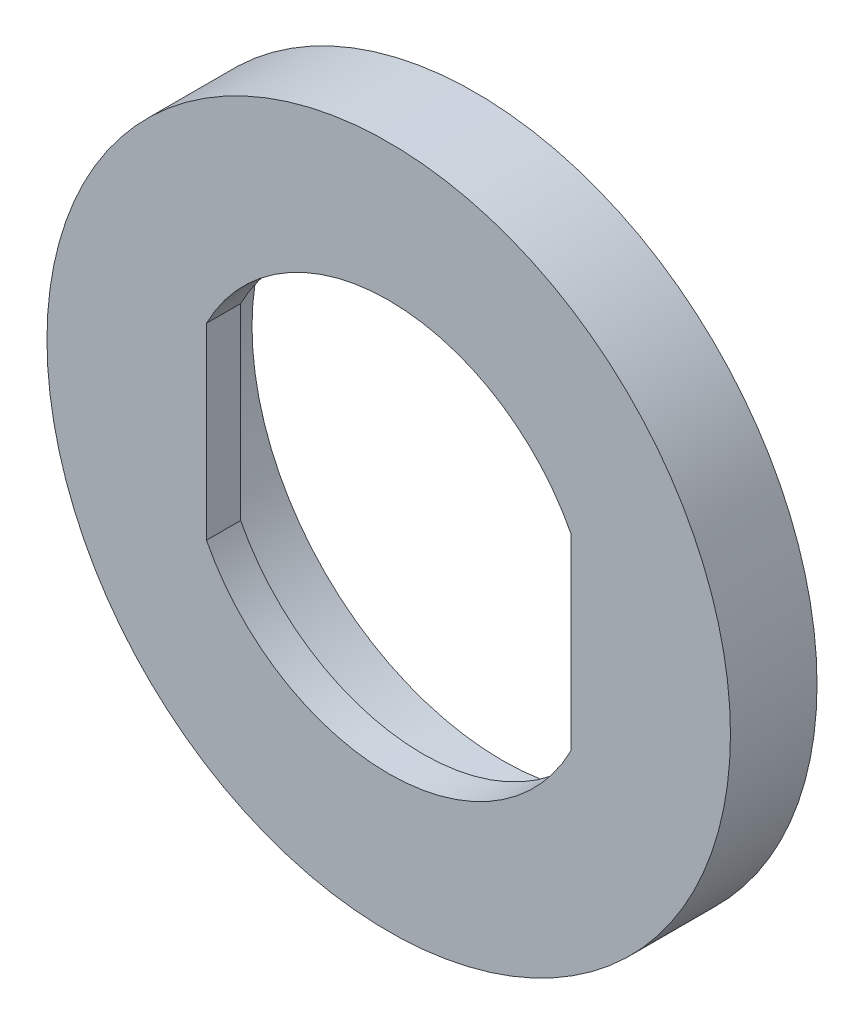
ISO-10303-21;
HEADER;
FILE_DESCRIPTION(('STEP AP214'),'2;1');
FILE_NAME('part.step','',(''),(''),'','','');
FILE_SCHEMA(('AUTOMOTIVE_DESIGN { 1 0 10303 214 1 1 1 1 }'));
ENDSEC;
DATA;
#1=APPLICATION_CONTEXT('core data for automotive mechanical design processes');
#2=APPLICATION_PROTOCOL_DEFINITION('international standard','automotive_design',2000,#1);
#3=PRODUCT_CONTEXT('',#1,'mechanical');
#4=PRODUCT('Part','Part','',(#3));
#5=PRODUCT_RELATED_PRODUCT_CATEGORY('part','',(#4));
#6=PRODUCT_DEFINITION_FORMATION('','',#4);
#7=PRODUCT_DEFINITION_CONTEXT('part definition',#1,'design');
#8=PRODUCT_DEFINITION('design','',#6,#7);
#9=PRODUCT_DEFINITION_SHAPE('','',#8);
#10=(LENGTH_UNIT() NAMED_UNIT(*) SI_UNIT(.MILLI.,.METRE.));
#11=(NAMED_UNIT(*) PLANE_ANGLE_UNIT() SI_UNIT($,.RADIAN.));
#12=(NAMED_UNIT(*) SI_UNIT($,.STERADIAN.) SOLID_ANGLE_UNIT());
#13=UNCERTAINTY_MEASURE_WITH_UNIT(LENGTH_MEASURE(1.E-05),#10,'distance_accuracy_value','');
#14=(GEOMETRIC_REPRESENTATION_CONTEXT(3) GLOBAL_UNCERTAINTY_ASSIGNED_CONTEXT((#13)) GLOBAL_UNIT_ASSIGNED_CONTEXT((#10,
#11,#12)) REPRESENTATION_CONTEXT('',''));
#15=CARTESIAN_POINT('',(0.,0.,0.));
#16=DIRECTION('',(0.,0.,1.));
#17=DIRECTION('',(1.,0.,0.));
#18=AXIS2_PLACEMENT_3D('',#15,#16,#17);
#19=CARTESIAN_POINT('',(0.,0.,1.20000000000001));
#20=DIRECTION('',(0.,0.,1.));
#21=DIRECTION('',(1.,0.,0.));
#22=AXIS2_PLACEMENT_3D('',#19,#20,#21);
#23=PLANE('',#22);
#24=CARTESIAN_POINT('',(0.,0.,1.20000000000001));
#25=DIRECTION('',(0.,0.,1.));
#26=DIRECTION('',(1.,0.,0.));
#27=AXIS2_PLACEMENT_3D('',#24,#25,#26);
#28=CIRCLE('',#27,15.);
#29=CARTESIAN_POINT('',(15.,0.,1.20000000000001));
#30=VERTEX_POINT('',#29);
#31=EDGE_CURVE('E115',#30,#30,#28,.T.);
#32=ORIENTED_EDGE('',*,*,#31,.F.);
#33=EDGE_LOOP('',(#32));
#34=FACE_BOUND('',#33,.T.);
#35=CARTESIAN_POINT('',(0.,0.,1.20000000000001));
#36=DIRECTION('',(0.,0.,1.));
#37=DIRECTION('',(1.,0.,0.));
#38=AXIS2_PLACEMENT_3D('',#35,#36,#37);
#39=CIRCLE('',#38,13.);
#40=CARTESIAN_POINT('',(13.,0.,1.20000000000001));
#41=VERTEX_POINT('',#40);
#42=EDGE_CURVE('E11',#41,#41,#39,.T.);
#43=ORIENTED_EDGE('',*,*,#42,.T.);
#44=EDGE_LOOP('',(#43));
#45=FACE_BOUND('',#44,.T.);
#46=ADVANCED_FACE('F32',(#34,#45),#23,.F.);
#47=CARTESIAN_POINT('',(0.,0.,1.20000000000001));
#48=DIRECTION('',(0.,0.,1.));
#49=DIRECTION('',(1.,0.,0.));
#50=AXIS2_PLACEMENT_3D('',#47,#48,#49);
#51=CYLINDRICAL_SURFACE('',#50,15.);
#52=ORIENTED_EDGE('',*,*,#31,.T.);
#53=EDGE_LOOP('',(#52));
#54=FACE_BOUND('',#53,.T.);
#55=CARTESIAN_POINT('',(0.,0.,5.));
#56=DIRECTION('',(0.,0.,1.));
#57=DIRECTION('',(1.,0.,0.));
#58=AXIS2_PLACEMENT_3D('',#55,#56,#57);
#59=CIRCLE('',#58,15.);
#60=CARTESIAN_POINT('',(15.,0.,5.));
#61=VERTEX_POINT('',#60);
#62=EDGE_CURVE('E112',#61,#61,#59,.T.);
#63=ORIENTED_EDGE('',*,*,#62,.F.);
#64=EDGE_LOOP('',(#63));
#65=FACE_BOUND('',#64,.T.);
#66=ADVANCED_FACE('F138',(#54,#65),#51,.T.);
#67=CARTESIAN_POINT('',(0.,0.,5.));
#68=DIRECTION('',(0.,0.,1.));
#69=DIRECTION('',(1.,0.,0.));
#70=AXIS2_PLACEMENT_3D('',#67,#68,#69);
#71=PLANE('',#70);
#72=CARTESIAN_POINT('',(0.,0.,5.));
#73=DIRECTION('',(0.,0.,1.));
#74=DIRECTION('',(1.,0.,0.));
#75=AXIS2_PLACEMENT_3D('',#72,#73,#74);
#76=CIRCLE('',#75,9.);
#77=CARTESIAN_POINT('',(8.,4.12310562561767,5.));
#78=VERTEX_POINT('',#77);
#79=CARTESIAN_POINT('',(-8.00000000000002,4.12310562561766,5.));
#80=VERTEX_POINT('',#79);
#81=EDGE_CURVE('E107',#78,#80,#76,.T.);
#82=ORIENTED_EDGE('',*,*,#81,.F.);
#83=DIRECTION('',(0.,1.,0.));
#84=VECTOR('',#83,1.);
#85=CARTESIAN_POINT('',(8.00000000000002,0.,5.));
#86=LINE('',#85,#84);
#87=CARTESIAN_POINT('',(8.00000000000002,-4.12310562561766,5.));
#88=VERTEX_POINT('',#87);
#89=EDGE_CURVE('E100',#88,#78,#86,.T.);
#90=ORIENTED_EDGE('',*,*,#89,.F.);
#91=CARTESIAN_POINT('',(0.,0.,5.));
#92=DIRECTION('',(0.,0.,1.));
#93=DIRECTION('',(1.,0.,0.));
#94=AXIS2_PLACEMENT_3D('',#91,#92,#93);
#95=CIRCLE('',#94,9.);
#96=CARTESIAN_POINT('',(-8.00000000000001,-4.12310562561766,5.));
#97=VERTEX_POINT('',#96);
#98=EDGE_CURVE('E80',#97,#88,#95,.T.);
#99=ORIENTED_EDGE('',*,*,#98,.F.);
#100=DIRECTION('',(0.,-1.,0.));
#101=VECTOR('',#100,1.);
#102=CARTESIAN_POINT('',(-8.00000000000001,0.,5.));
#103=LINE('',#102,#101);
#104=EDGE_CURVE('E105',#80,#97,#103,.T.);
#105=ORIENTED_EDGE('',*,*,#104,.F.);
#106=EDGE_LOOP('',(#82,#90,#99,#105));
#107=FACE_BOUND('',#106,.T.);
#108=ORIENTED_EDGE('',*,*,#62,.T.);
#109=EDGE_LOOP('',(#108));
#110=FACE_BOUND('',#109,.T.);
#111=ADVANCED_FACE('F144',(#107,#110),#71,.T.);
#112=CARTESIAN_POINT('',(0.,0.,4.));
#113=DIRECTION('',(0.,0.,-1.));
#114=DIRECTION('',(-1.,0.,0.));
#115=AXIS2_PLACEMENT_3D('',#112,#113,#114);
#116=CYLINDRICAL_SURFACE('',#115,13.);
#117=CARTESIAN_POINT('',(0.,0.,0.));
#118=DIRECTION('',(0.,0.,1.));
#119=DIRECTION('',(1.,0.,0.));
#120=AXIS2_PLACEMENT_3D('',#117,#118,#119);
#121=CIRCLE('',#120,13.);
#122=CARTESIAN_POINT('',(13.,0.,0.));
#123=VERTEX_POINT('',#122);
#124=EDGE_CURVE('E36',#123,#123,#121,.T.);
#125=ORIENTED_EDGE('',*,*,#124,.T.);
#126=EDGE_LOOP('',(#125));
#127=FACE_BOUND('',#126,.T.);
#128=ORIENTED_EDGE('',*,*,#42,.F.);
#129=EDGE_LOOP('',(#128));
#130=FACE_BOUND('',#129,.T.);
#131=ADVANCED_FACE('F34',(#127,#130),#116,.T.);
#132=CARTESIAN_POINT('',(0.,0.,4.));
#133=DIRECTION('',(0.,0.,-1.));
#134=DIRECTION('',(-1.,0.,0.));
#135=AXIS2_PLACEMENT_3D('',#132,#133,#134);
#136=CYLINDRICAL_SURFACE('',#135,11.);
#137=CARTESIAN_POINT('',(0.,0.,0.));
#138=DIRECTION('',(0.,0.,1.));
#139=DIRECTION('',(1.,0.,0.));
#140=AXIS2_PLACEMENT_3D('',#137,#138,#139);
#141=CIRCLE('',#140,11.);
#142=CARTESIAN_POINT('',(11.,0.,0.));
#143=VERTEX_POINT('',#142);
#144=EDGE_CURVE('E117',#143,#143,#141,.T.);
#145=ORIENTED_EDGE('',*,*,#144,.F.);
#146=EDGE_LOOP('',(#145));
#147=FACE_BOUND('',#146,.T.);
#148=CARTESIAN_POINT('',(0.,0.,3.5));
#149=DIRECTION('',(0.,0.,-1.));
#150=DIRECTION('',(-1.,0.,0.));
#151=AXIS2_PLACEMENT_3D('',#148,#149,#150);
#152=CIRCLE('',#151,11.);
#153=CARTESIAN_POINT('',(-11.,0.,3.5));
#154=VERTEX_POINT('',#153);
#155=EDGE_CURVE('E109',#154,#154,#152,.T.);
#156=ORIENTED_EDGE('',*,*,#155,.F.);
#157=EDGE_LOOP('',(#156));
#158=FACE_BOUND('',#157,.T.);
#159=ADVANCED_FACE('F128',(#147,#158),#136,.F.);
#160=CARTESIAN_POINT('',(0.,0.,0.));
#161=DIRECTION('',(0.,0.,1.));
#162=DIRECTION('',(1.,0.,0.));
#163=AXIS2_PLACEMENT_3D('',#160,#161,#162);
#164=PLANE('',#163);
#165=ORIENTED_EDGE('',*,*,#124,.F.);
#166=EDGE_LOOP('',(#165));
#167=FACE_BOUND('',#166,.T.);
#168=ORIENTED_EDGE('',*,*,#144,.T.);
#169=EDGE_LOOP('',(#168));
#170=FACE_BOUND('',#169,.T.);
#171=ADVANCED_FACE('F126',(#167,#170),#164,.F.);
#172=CARTESIAN_POINT('',(0.,0.,3.5));
#173=DIRECTION('',(0.,0.,-1.));
#174=DIRECTION('',(-1.,0.,0.));
#175=AXIS2_PLACEMENT_3D('',#172,#173,#174);
#176=PLANE('',#175);
#177=CARTESIAN_POINT('',(0.,0.,3.5));
#178=DIRECTION('',(0.,0.,-1.));
#179=DIRECTION('',(-1.,0.,0.));
#180=AXIS2_PLACEMENT_3D('',#177,#178,#179);
#181=CIRCLE('',#180,9.);
#182=CARTESIAN_POINT('',(-8.00000000000002,4.12310562561766,3.5));
#183=VERTEX_POINT('',#182);
#184=CARTESIAN_POINT('',(8.,4.12310562561767,3.5));
#185=VERTEX_POINT('',#184);
#186=EDGE_CURVE('E56',#183,#185,#181,.T.);
#187=ORIENTED_EDGE('',*,*,#186,.F.);
#188=DIRECTION('',(0.,1.,0.));
#189=VECTOR('',#188,1.);
#190=CARTESIAN_POINT('',(-8.00000000000001,-4.12310562561767,3.5));
#191=LINE('',#190,#189);
#192=CARTESIAN_POINT('',(-8.00000000000001,-4.12310562561767,3.5));
#193=VERTEX_POINT('',#192);
#194=EDGE_CURVE('E93',#193,#183,#191,.T.);
#195=ORIENTED_EDGE('',*,*,#194,.F.);
#196=CARTESIAN_POINT('',(0.,0.,3.5));
#197=DIRECTION('',(0.,0.,-1.));
#198=DIRECTION('',(-1.,0.,0.));
#199=AXIS2_PLACEMENT_3D('',#196,#197,#198);
#200=CIRCLE('',#199,9.);
#201=CARTESIAN_POINT('',(8.00000000000002,-4.12310562561766,3.5));
#202=VERTEX_POINT('',#201);
#203=EDGE_CURVE('E77',#202,#193,#200,.T.);
#204=ORIENTED_EDGE('',*,*,#203,.F.);
#205=DIRECTION('',(0.,-1.,0.));
#206=VECTOR('',#205,1.);
#207=CARTESIAN_POINT('',(8.00000000000002,-4.12310562561766,3.5));
#208=LINE('',#207,#206);
#209=EDGE_CURVE('E86',#185,#202,#208,.T.);
#210=ORIENTED_EDGE('',*,*,#209,.F.);
#211=EDGE_LOOP('',(#187,#195,#204,#210));
#212=FACE_BOUND('',#211,.T.);
#213=ORIENTED_EDGE('',*,*,#155,.T.);
#214=EDGE_LOOP('',(#213));
#215=FACE_BOUND('',#214,.T.);
#216=ADVANCED_FACE('F90',(#212,#215),#176,.T.);
#217=CARTESIAN_POINT('',(0.,0.,5.50000000000001));
#218=DIRECTION('',(0.,0.,-1.));
#219=DIRECTION('',(-1.,0.,0.));
#220=AXIS2_PLACEMENT_3D('',#217,#218,#219);
#221=CYLINDRICAL_SURFACE('',#220,9.);
#222=ORIENTED_EDGE('',*,*,#81,.T.);
#223=DIRECTION('',(0.,0.,-1.));
#224=VECTOR('',#223,1.);
#225=CARTESIAN_POINT('',(-8.00000000000002,4.12310562561766,5.50000000000001));
#226=LINE('',#225,#224);
#227=EDGE_CURVE('E98',#80,#183,#226,.T.);
#228=ORIENTED_EDGE('',*,*,#227,.T.);
#229=ORIENTED_EDGE('',*,*,#186,.T.);
#230=DIRECTION('',(0.,0.,-1.));
#231=VECTOR('',#230,1.);
#232=CARTESIAN_POINT('',(8.,4.12310562561767,5.50000000000001));
#233=LINE('',#232,#231);
#234=EDGE_CURVE('E83',#78,#185,#233,.T.);
#235=ORIENTED_EDGE('',*,*,#234,.F.);
#236=EDGE_LOOP('',(#222,#228,#229,#235));
#237=FACE_BOUND('',#236,.T.);
#238=ADVANCED_FACE('F133',(#237),#221,.F.);
#239=CARTESIAN_POINT('',(-8.00000000000001,-4.12310562561766,5.50000000000001));
#240=DIRECTION('',(-1.,0.,0.));
#241=DIRECTION('',(0.,0.,1.));
#242=AXIS2_PLACEMENT_3D('',#239,#240,#241);
#243=PLANE('',#242);
#244=ORIENTED_EDGE('',*,*,#104,.T.);
#245=DIRECTION('',(0.,0.,-1.));
#246=VECTOR('',#245,1.);
#247=CARTESIAN_POINT('',(-8.00000000000001,-4.12310562561766,5.50000000000001));
#248=LINE('',#247,#246);
#249=EDGE_CURVE('E82',#97,#193,#248,.T.);
#250=ORIENTED_EDGE('',*,*,#249,.T.);
#251=ORIENTED_EDGE('',*,*,#194,.T.);
#252=ORIENTED_EDGE('',*,*,#227,.F.);
#253=EDGE_LOOP('',(#244,#250,#251,#252));
#254=FACE_BOUND('',#253,.T.);
#255=ADVANCED_FACE('F155',(#254),#243,.F.);
#256=CARTESIAN_POINT('',(0.,0.,5.50000000000001));
#257=DIRECTION('',(0.,0.,-1.));
#258=DIRECTION('',(-1.,0.,0.));
#259=AXIS2_PLACEMENT_3D('',#256,#257,#258);
#260=CYLINDRICAL_SURFACE('',#259,9.);
#261=ORIENTED_EDGE('',*,*,#98,.T.);
#262=DIRECTION('',(0.,0.,-1.));
#263=VECTOR('',#262,1.);
#264=CARTESIAN_POINT('',(8.00000000000002,-4.12310562561766,5.50000000000001));
#265=LINE('',#264,#263);
#266=EDGE_CURVE('E48',#88,#202,#265,.T.);
#267=ORIENTED_EDGE('',*,*,#266,.T.);
#268=ORIENTED_EDGE('',*,*,#203,.T.);
#269=ORIENTED_EDGE('',*,*,#249,.F.);
#270=EDGE_LOOP('',(#261,#267,#268,#269));
#271=FACE_BOUND('',#270,.T.);
#272=ADVANCED_FACE('F74',(#271),#260,.F.);
#273=CARTESIAN_POINT('',(8.00000000000002,-4.12310562561766,5.50000000000001));
#274=DIRECTION('',(1.,0.,0.));
#275=DIRECTION('',(0.,0.,-1.));
#276=AXIS2_PLACEMENT_3D('',#273,#274,#275);
#277=PLANE('',#276);
#278=ORIENTED_EDGE('',*,*,#89,.T.);
#279=ORIENTED_EDGE('',*,*,#234,.T.);
#280=ORIENTED_EDGE('',*,*,#209,.T.);
#281=ORIENTED_EDGE('',*,*,#266,.F.);
#282=EDGE_LOOP('',(#278,#279,#280,#281));
#283=FACE_BOUND('',#282,.T.);
#284=ADVANCED_FACE('F87',(#283),#277,.F.);
#285=CLOSED_SHELL('',(#46,#66,#111,#131,#159,#171,#216,#238,#255,#272,#284));
#286=MANIFOLD_SOLID_BREP('B2',#285);
#287=ADVANCED_BREP_SHAPE_REPRESENTATION('',(#18,#286),#14);
#288=SHAPE_DEFINITION_REPRESENTATION(#9,#287);
ENDSEC;
END-ISO-10303-21;
